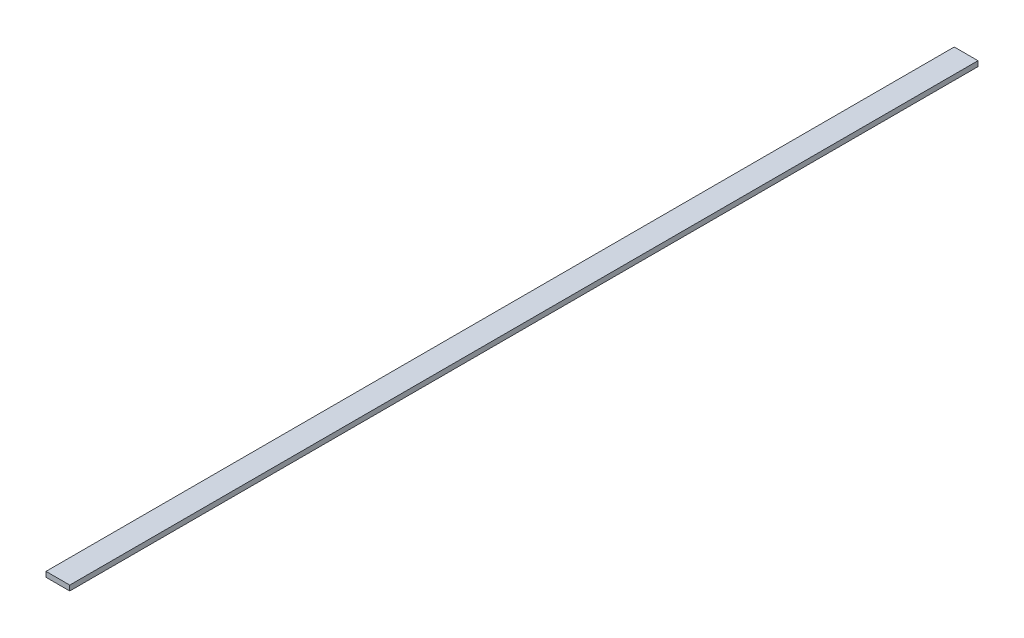
ISO-10303-21;
HEADER;
FILE_DESCRIPTION(('STEP AP214'),'2;1');
FILE_NAME('part.step','',(''),(''),'','','');
FILE_SCHEMA(('AUTOMOTIVE_DESIGN { 1 0 10303 214 1 1 1 1 }'));
ENDSEC;
DATA;
#1=APPLICATION_CONTEXT('core data for automotive mechanical design processes');
#2=APPLICATION_PROTOCOL_DEFINITION('international standard','automotive_design',2000,#1);
#3=PRODUCT_CONTEXT('',#1,'mechanical');
#4=PRODUCT('Part','Part','',(#3));
#5=PRODUCT_RELATED_PRODUCT_CATEGORY('part','',(#4));
#6=PRODUCT_DEFINITION_FORMATION('','',#4);
#7=PRODUCT_DEFINITION_CONTEXT('part definition',#1,'design');
#8=PRODUCT_DEFINITION('design','',#6,#7);
#9=PRODUCT_DEFINITION_SHAPE('','',#8);
#10=(LENGTH_UNIT() NAMED_UNIT(*) SI_UNIT(.MILLI.,.METRE.));
#11=(NAMED_UNIT(*) PLANE_ANGLE_UNIT() SI_UNIT($,.RADIAN.));
#12=(NAMED_UNIT(*) SI_UNIT($,.STERADIAN.) SOLID_ANGLE_UNIT());
#13=UNCERTAINTY_MEASURE_WITH_UNIT(LENGTH_MEASURE(1.E-05),#10,'distance_accuracy_value','');
#14=(GEOMETRIC_REPRESENTATION_CONTEXT(3) GLOBAL_UNCERTAINTY_ASSIGNED_CONTEXT((#13)) GLOBAL_UNIT_ASSIGNED_CONTEXT((#10,
#11,#12)) REPRESENTATION_CONTEXT('',''));
#15=CARTESIAN_POINT('',(0.,0.,0.));
#16=DIRECTION('',(0.,0.,1.));
#17=DIRECTION('',(1.,0.,0.));
#18=AXIS2_PLACEMENT_3D('',#15,#16,#17);
#19=CARTESIAN_POINT('',(-99.225,-15.67929634175,9.400000492699));
#20=DIRECTION('',(-6.20387742741273E-06,-0.999999999980756,0.));
#21=DIRECTION('',(0.999999999980756,-6.20387742741273E-06,0.));
#22=AXIS2_PLACEMENT_3D('',#19,#20,#21);
#23=PLANE('',#22);
#24=DIRECTION('',(0.999999999980756,-6.20387742741273E-06,0.));
#25=VECTOR('',#24,1.);
#26=CARTESIAN_POINT('',(-99.225,-15.67929634175,84.93001012761));
#27=LINE('',#26,#25);
#28=CARTESIAN_POINT('',(-97.25,-15.679307913704,84.93001012761));
#29=VERTEX_POINT('',#28);
#30=CARTESIAN_POINT('',(-101.2,-15.6792840890921,84.93001012761));
#31=VERTEX_POINT('',#30);
#32=EDGE_CURVE('E20',#29,#31,#27,.F.);
#33=ORIENTED_EDGE('',*,*,#32,.T.);
#34=DIRECTION('',(0.,0.,1.));
#35=VECTOR('',#34,1.);
#36=CARTESIAN_POINT('',(-101.2,-15.6792840890921,-68.8));
#37=LINE('',#36,#35);
#38=CARTESIAN_POINT('',(-101.2,-15.6792840890921,-66.130009340532));
#39=VERTEX_POINT('',#38);
#40=EDGE_CURVE('E82',#39,#31,#37,.T.);
#41=ORIENTED_EDGE('',*,*,#40,.F.);
#42=DIRECTION('',(-0.999999999980721,6.20387742741251E-06,2.63228394314825E-07));
#43=VECTOR('',#42,1.);
#44=CARTESIAN_POINT('',(-99.225002728599,-15.6792963417331,-66.1300096004693));
#45=LINE('',#44,#43);
#46=CARTESIAN_POINT('',(-97.25,-15.679307913704,-66.1300101203461));
#47=VERTEX_POINT('',#46);
#48=EDGE_CURVE('E58',#47,#39,#45,.T.);
#49=ORIENTED_EDGE('',*,*,#48,.F.);
#50=DIRECTION('',(0.,0.,1.));
#51=VECTOR('',#50,1.);
#52=CARTESIAN_POINT('',(-97.25,-15.679307233,-68.8));
#53=LINE('',#52,#51);
#54=EDGE_CURVE('E54',#47,#29,#53,.T.);
#55=ORIENTED_EDGE('',*,*,#54,.T.);
#56=EDGE_LOOP('',(#33,#41,#49,#55));
#57=FACE_BOUND('',#56,.T.);
#58=ADVANCED_FACE('F17',(#57),#23,.T.);
#59=CARTESIAN_POINT('',(-99.225,-15.24999387239,84.93001012761));
#60=DIRECTION('',(0.,0.,-1.));
#61=DIRECTION('',(-1.,0.,0.));
#62=AXIS2_PLACEMENT_3D('',#59,#60,#61);
#63=PLANE('',#62);
#64=DIRECTION('',(0.,1.,0.));
#65=VECTOR('',#64,1.);
#66=CARTESIAN_POINT('',(-97.25,-54.,84.93001012761));
#67=LINE('',#66,#65);
#68=CARTESIAN_POINT('',(-97.25,-14.8206791503695,84.93001012761));
#69=VERTEX_POINT('',#68);
#70=EDGE_CURVE('E62',#29,#69,#67,.T.);
#71=ORIENTED_EDGE('',*,*,#70,.T.);
#72=DIRECTION('',(-1.,-1.096844135042E-12,0.));
#73=VECTOR('',#72,1.);
#74=CARTESIAN_POINT('',(-99.22499999903,-14.82067915037,84.93001012761));
#75=LINE('',#74,#73);
#76=CARTESIAN_POINT('',(-101.2,-14.8206791503714,84.93001012761));
#77=VERTEX_POINT('',#76);
#78=EDGE_CURVE('E83',#77,#69,#75,.F.);
#79=ORIENTED_EDGE('',*,*,#78,.F.);
#80=DIRECTION('',(0.,1.,0.));
#81=VECTOR('',#80,1.);
#82=CARTESIAN_POINT('',(-101.2,-54.,84.93001012761));
#83=LINE('',#82,#81);
#84=EDGE_CURVE('E69',#31,#77,#83,.T.);
#85=ORIENTED_EDGE('',*,*,#84,.F.);
#86=ORIENTED_EDGE('',*,*,#32,.F.);
#87=EDGE_LOOP('',(#71,#79,#85,#86));
#88=FACE_BOUND('',#87,.T.);
#89=ADVANCED_FACE('F66',(#88),#63,.F.);
#90=CARTESIAN_POINT('',(-97.25,-54.,-68.8));
#91=DIRECTION('',(-1.,0.,0.));
#92=DIRECTION('',(0.,0.,1.));
#93=AXIS2_PLACEMENT_3D('',#90,#91,#92);
#94=PLANE('',#93);
#95=DIRECTION('',(0.,0.,1.));
#96=VECTOR('',#95,1.);
#97=CARTESIAN_POINT('',(-97.25,-14.8206791503678,9.39999951366));
#98=LINE('',#97,#96);
#99=CARTESIAN_POINT('',(-97.25,-14.8206791503686,-66.130010091463));
#100=VERTEX_POINT('',#99);
#101=EDGE_CURVE('E73',#69,#100,#98,.F.);
#102=ORIENTED_EDGE('',*,*,#101,.F.);
#103=ORIENTED_EDGE('',*,*,#70,.F.);
#104=ORIENTED_EDGE('',*,*,#54,.F.);
#105=DIRECTION('',(0.,1.,0.));
#106=VECTOR('',#105,1.);
#107=CARTESIAN_POINT('',(-97.25,-15.24998756429,-66.1300101203461));
#108=LINE('',#107,#106);
#109=EDGE_CURVE('E75',#100,#47,#108,.F.);
#110=ORIENTED_EDGE('',*,*,#109,.F.);
#111=EDGE_LOOP('',(#102,#103,#104,#110));
#112=FACE_BOUND('',#111,.T.);
#113=ADVANCED_FACE('F71',(#112),#94,.F.);
#114=CARTESIAN_POINT('',(-99.22500006522,-15.24998756429,-66.13000960047));
#115=DIRECTION('',(-2.63228394319891E-07,0.,-0.999999999999965));
#116=DIRECTION('',(-0.999999999999965,0.,2.63228394319891E-07));
#117=AXIS2_PLACEMENT_3D('',#114,#115,#116);
#118=PLANE('',#117);
#119=ORIENTED_EDGE('',*,*,#48,.T.);
#120=DIRECTION('',(0.,1.,0.));
#121=VECTOR('',#120,1.);
#122=CARTESIAN_POINT('',(-101.2,-54.,-66.13000960047));
#123=LINE('',#122,#121);
#124=CARTESIAN_POINT('',(-101.2,-14.8206791503705,-66.13000960047));
#125=VERTEX_POINT('',#124);
#126=EDGE_CURVE('E35',#125,#39,#123,.F.);
#127=ORIENTED_EDGE('',*,*,#126,.F.);
#128=DIRECTION('',(-1.,-1.096844135042E-12,0.));
#129=VECTOR('',#128,1.);
#130=CARTESIAN_POINT('',(-99.22499999903,-14.82067915037,-66.13001006258));
#131=LINE('',#130,#129);
#132=EDGE_CURVE('E26',#100,#125,#131,.T.);
#133=ORIENTED_EDGE('',*,*,#132,.F.);
#134=ORIENTED_EDGE('',*,*,#109,.T.);
#135=EDGE_LOOP('',(#119,#127,#133,#134));
#136=FACE_BOUND('',#135,.T.);
#137=ADVANCED_FACE('F106',(#136),#118,.T.);
#138=CARTESIAN_POINT('',(-101.2,-54.,-68.8));
#139=DIRECTION('',(-1.,0.,0.));
#140=DIRECTION('',(0.,0.,1.));
#141=AXIS2_PLACEMENT_3D('',#138,#139,#140);
#142=PLANE('',#141);
#143=ORIENTED_EDGE('',*,*,#126,.T.);
#144=ORIENTED_EDGE('',*,*,#40,.T.);
#145=ORIENTED_EDGE('',*,*,#84,.T.);
#146=DIRECTION('',(0.,0.,1.));
#147=VECTOR('',#146,1.);
#148=CARTESIAN_POINT('',(-101.2,-14.8206791503722,9.39999951366));
#149=LINE('',#148,#147);
#150=EDGE_CURVE('E11',#125,#77,#149,.T.);
#151=ORIENTED_EDGE('',*,*,#150,.F.);
#152=EDGE_LOOP('',(#143,#144,#145,#151));
#153=FACE_BOUND('',#152,.T.);
#154=ADVANCED_FACE('F104',(#153),#142,.T.);
#155=CARTESIAN_POINT('',(-99.22499999903,-14.82067915037,9.39999951366));
#156=DIRECTION('',(-1.096844135042E-12,1.,0.));
#157=DIRECTION('',(-1.,-1.096844135042E-12,0.));
#158=AXIS2_PLACEMENT_3D('',#155,#156,#157);
#159=PLANE('',#158);
#160=ORIENTED_EDGE('',*,*,#132,.T.);
#161=ORIENTED_EDGE('',*,*,#150,.T.);
#162=ORIENTED_EDGE('',*,*,#78,.T.);
#163=ORIENTED_EDGE('',*,*,#101,.T.);
#164=EDGE_LOOP('',(#160,#161,#162,#163));
#165=FACE_BOUND('',#164,.T.);
#166=ADVANCED_FACE('F103',(#165),#159,.T.);
#167=CLOSED_SHELL('',(#58,#89,#113,#137,#154,#166));
#168=MANIFOLD_SOLID_BREP('B1',#167);
#169=ADVANCED_BREP_SHAPE_REPRESENTATION('',(#18,#168),#14);
#170=SHAPE_DEFINITION_REPRESENTATION(#9,#169);
ENDSEC;
END-ISO-10303-21;
